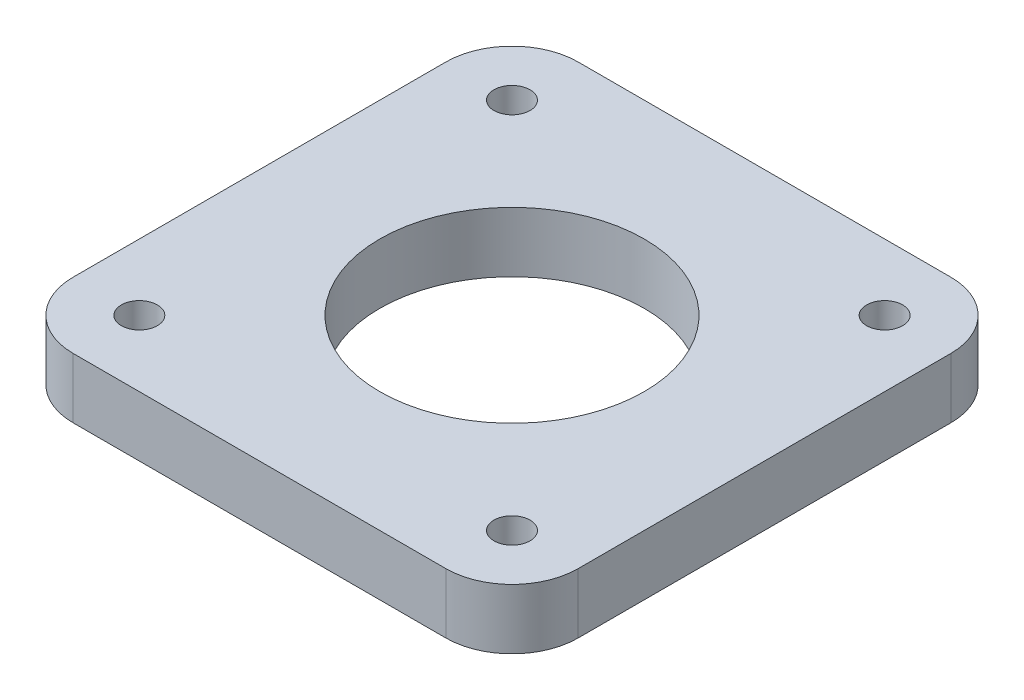
ISO-10303-21;
HEADER;
FILE_DESCRIPTION(('STEP AP214'),'2;1');
FILE_NAME('part.step','',(''),(''),'','','');
FILE_SCHEMA(('AUTOMOTIVE_DESIGN { 1 0 10303 214 1 1 1 1 }'));
ENDSEC;
DATA;
#1=APPLICATION_CONTEXT('core data for automotive mechanical design processes');
#2=APPLICATION_PROTOCOL_DEFINITION('international standard','automotive_design',2000,#1);
#3=PRODUCT_CONTEXT('',#1,'mechanical');
#4=PRODUCT('Part','Part','',(#3));
#5=PRODUCT_RELATED_PRODUCT_CATEGORY('part','',(#4));
#6=PRODUCT_DEFINITION_FORMATION('','',#4);
#7=PRODUCT_DEFINITION_CONTEXT('part definition',#1,'design');
#8=PRODUCT_DEFINITION('design','',#6,#7);
#9=PRODUCT_DEFINITION_SHAPE('','',#8);
#10=(LENGTH_UNIT() NAMED_UNIT(*) SI_UNIT(.MILLI.,.METRE.));
#11=(NAMED_UNIT(*) PLANE_ANGLE_UNIT() SI_UNIT($,.RADIAN.));
#12=(NAMED_UNIT(*) SI_UNIT($,.STERADIAN.) SOLID_ANGLE_UNIT());
#13=UNCERTAINTY_MEASURE_WITH_UNIT(LENGTH_MEASURE(1.E-05),#10,'distance_accuracy_value','');
#14=(GEOMETRIC_REPRESENTATION_CONTEXT(3) GLOBAL_UNCERTAINTY_ASSIGNED_CONTEXT((#13)) GLOBAL_UNIT_ASSIGNED_CONTEXT((#10,
#11,#12)) REPRESENTATION_CONTEXT('',''));
#15=CARTESIAN_POINT('',(0.,0.,0.));
#16=DIRECTION('',(0.,0.,1.));
#17=DIRECTION('',(1.,0.,0.));
#18=AXIS2_PLACEMENT_3D('',#15,#16,#17);
#19=CARTESIAN_POINT('',(15.5,5.,-6.95263157894736));
#20=DIRECTION('',(0.,-1.,0.));
#21=DIRECTION('',(0.,0.,-1.));
#22=AXIS2_PLACEMENT_3D('',#19,#20,#21);
#23=PLANE('',#22);
#24=CARTESIAN_POINT('',(-15.5,5.,-6.95263157894737));
#25=DIRECTION('',(0.,1.,0.));
#26=DIRECTION('',(0.,0.,-1.));
#27=AXIS2_PLACEMENT_3D('',#24,#25,#26);
#28=CIRCLE('',#27,1.5);
#29=CARTESIAN_POINT('',(-15.5,5.,-8.45263157894737));
#30=VERTEX_POINT('',#29);
#31=EDGE_CURVE('E194',#30,#30,#28,.T.);
#32=ORIENTED_EDGE('',*,*,#31,.F.);
#33=EDGE_LOOP('',(#32));
#34=FACE_BOUND('',#33,.T.);
#35=CARTESIAN_POINT('',(15.5,5.,-6.95263157894737));
#36=DIRECTION('',(0.,1.,0.));
#37=DIRECTION('',(0.,0.,1.));
#38=AXIS2_PLACEMENT_3D('',#35,#36,#37);
#39=CIRCLE('',#38,1.5);
#40=CARTESIAN_POINT('',(15.5,5.,-5.45263157894737));
#41=VERTEX_POINT('',#40);
#42=EDGE_CURVE('E182',#41,#41,#39,.T.);
#43=ORIENTED_EDGE('',*,*,#42,.F.);
#44=EDGE_LOOP('',(#43));
#45=FACE_BOUND('',#44,.T.);
#46=CARTESIAN_POINT('',(15.5,5.,-6.95263157894736));
#47=DIRECTION('',(0.,1.,0.));
#48=DIRECTION('',(0.,0.,-1.));
#49=AXIS2_PLACEMENT_3D('',#46,#47,#48);
#50=CIRCLE('',#49,5.50000000000002);
#51=CARTESIAN_POINT('',(21.,5.,-6.95263157894737));
#52=VERTEX_POINT('',#51);
#53=CARTESIAN_POINT('',(15.5,5.,-12.4526315789474));
#54=VERTEX_POINT('',#53);
#55=EDGE_CURVE('E145',#52,#54,#50,.T.);
#56=ORIENTED_EDGE('',*,*,#55,.T.);
#57=DIRECTION('',(-1.,0.,0.));
#58=VECTOR('',#57,1.);
#59=CARTESIAN_POINT('',(-15.5,5.,-12.4526315789474));
#60=LINE('',#59,#58);
#61=CARTESIAN_POINT('',(-15.5,5.,-12.4526315789474));
#62=VERTEX_POINT('',#61);
#63=EDGE_CURVE('E93',#54,#62,#60,.T.);
#64=ORIENTED_EDGE('',*,*,#63,.T.);
#65=CARTESIAN_POINT('',(-15.5,5.,-6.95263157894734));
#66=DIRECTION('',(0.,1.,0.));
#67=DIRECTION('',(0.,0.,1.));
#68=AXIS2_PLACEMENT_3D('',#65,#66,#67);
#69=CIRCLE('',#68,5.50000000000003);
#70=CARTESIAN_POINT('',(-21.,5.,-6.95263157894737));
#71=VERTEX_POINT('',#70);
#72=EDGE_CURVE('E160',#62,#71,#69,.T.);
#73=ORIENTED_EDGE('',*,*,#72,.T.);
#74=DIRECTION('',(0.,0.,1.));
#75=VECTOR('',#74,1.);
#76=CARTESIAN_POINT('',(-21.,5.,-6.95263157894737));
#77=LINE('',#76,#75);
#78=CARTESIAN_POINT('',(-21.,5.,24.0473684210526));
#79=VERTEX_POINT('',#78);
#80=EDGE_CURVE('E173',#71,#79,#77,.T.);
#81=ORIENTED_EDGE('',*,*,#80,.T.);
#82=CARTESIAN_POINT('',(-15.5,5.,24.0473684210526));
#83=DIRECTION('',(0.,1.,0.));
#84=DIRECTION('',(0.,0.,1.));
#85=AXIS2_PLACEMENT_3D('',#82,#83,#84);
#86=CIRCLE('',#85,5.50000000000002);
#87=CARTESIAN_POINT('',(-15.5,5.,29.5473684210526));
#88=VERTEX_POINT('',#87);
#89=EDGE_CURVE('E112',#79,#88,#86,.T.);
#90=ORIENTED_EDGE('',*,*,#89,.T.);
#91=DIRECTION('',(1.,0.,0.));
#92=VECTOR('',#91,1.);
#93=CARTESIAN_POINT('',(-15.5,5.,29.5473684210526));
#94=LINE('',#93,#92);
#95=CARTESIAN_POINT('',(15.5,5.,29.5473684210526));
#96=VERTEX_POINT('',#95);
#97=EDGE_CURVE('E106',#88,#96,#94,.T.);
#98=ORIENTED_EDGE('',*,*,#97,.T.);
#99=CARTESIAN_POINT('',(15.5,5.,24.0473684210526));
#100=DIRECTION('',(0.,1.,0.));
#101=DIRECTION('',(0.,0.,-1.));
#102=AXIS2_PLACEMENT_3D('',#99,#100,#101);
#103=CIRCLE('',#102,5.50000000000002);
#104=CARTESIAN_POINT('',(21.,5.,24.0473684210526));
#105=VERTEX_POINT('',#104);
#106=EDGE_CURVE('E110',#96,#105,#103,.T.);
#107=ORIENTED_EDGE('',*,*,#106,.T.);
#108=DIRECTION('',(0.,0.,-1.));
#109=VECTOR('',#108,1.);
#110=CARTESIAN_POINT('',(21.,5.,-6.95263157894737));
#111=LINE('',#110,#109);
#112=EDGE_CURVE('E50',#105,#52,#111,.T.);
#113=ORIENTED_EDGE('',*,*,#112,.T.);
#114=EDGE_LOOP('',(#56,#64,#73,#81,#90,#98,#107,#113));
#115=FACE_BOUND('',#114,.T.);
#116=CARTESIAN_POINT('',(0.,5.,8.54736842105263));
#117=DIRECTION('',(0.,1.,0.));
#118=DIRECTION('',(0.,0.,1.));
#119=AXIS2_PLACEMENT_3D('',#116,#117,#118);
#120=CIRCLE('',#119,11.);
#121=CARTESIAN_POINT('',(0.,5.,19.5473684210526));
#122=VERTEX_POINT('',#121);
#123=EDGE_CURVE('E134',#122,#122,#120,.T.);
#124=ORIENTED_EDGE('',*,*,#123,.F.);
#125=EDGE_LOOP('',(#124));
#126=FACE_BOUND('',#125,.T.);
#127=CARTESIAN_POINT('',(15.5,5.,24.0473684210526));
#128=DIRECTION('',(0.,1.,0.));
#129=DIRECTION('',(0.,0.,-1.));
#130=AXIS2_PLACEMENT_3D('',#127,#128,#129);
#131=CIRCLE('',#130,1.5);
#132=CARTESIAN_POINT('',(15.5,5.,22.5473684210526));
#133=VERTEX_POINT('',#132);
#134=EDGE_CURVE('E188',#133,#133,#131,.T.);
#135=ORIENTED_EDGE('',*,*,#134,.F.);
#136=EDGE_LOOP('',(#135));
#137=FACE_BOUND('',#136,.T.);
#138=CARTESIAN_POINT('',(-15.5,5.,24.0473684210526));
#139=DIRECTION('',(0.,1.,0.));
#140=DIRECTION('',(0.,0.,1.));
#141=AXIS2_PLACEMENT_3D('',#138,#139,#140);
#142=CIRCLE('',#141,1.5);
#143=CARTESIAN_POINT('',(-15.5,5.,25.5473684210526));
#144=VERTEX_POINT('',#143);
#145=EDGE_CURVE('E200',#144,#144,#142,.T.);
#146=ORIENTED_EDGE('',*,*,#145,.F.);
#147=EDGE_LOOP('',(#146));
#148=FACE_BOUND('',#147,.T.);
#149=ADVANCED_FACE('F33',(#34,#45,#115,#126,#137,#148),#23,.F.);
#150=CARTESIAN_POINT('',(15.5,0.,-6.95263157894736));
#151=DIRECTION('',(0.,-1.,0.));
#152=DIRECTION('',(0.,0.,-1.));
#153=AXIS2_PLACEMENT_3D('',#150,#151,#152);
#154=PLANE('',#153);
#155=CARTESIAN_POINT('',(-15.5,0.,-6.95263157894737));
#156=DIRECTION('',(0.,1.,0.));
#157=DIRECTION('',(0.,0.,-1.));
#158=AXIS2_PLACEMENT_3D('',#155,#156,#157);
#159=CIRCLE('',#158,1.5);
#160=CARTESIAN_POINT('',(-15.5,0.,-8.45263157894737));
#161=VERTEX_POINT('',#160);
#162=EDGE_CURVE('E197',#161,#161,#159,.T.);
#163=ORIENTED_EDGE('',*,*,#162,.T.);
#164=EDGE_LOOP('',(#163));
#165=FACE_BOUND('',#164,.T.);
#166=CARTESIAN_POINT('',(15.5,0.,-6.95263157894737));
#167=DIRECTION('',(0.,1.,0.));
#168=DIRECTION('',(0.,0.,1.));
#169=AXIS2_PLACEMENT_3D('',#166,#167,#168);
#170=CIRCLE('',#169,1.5);
#171=CARTESIAN_POINT('',(15.5,0.,-5.45263157894737));
#172=VERTEX_POINT('',#171);
#173=EDGE_CURVE('E185',#172,#172,#170,.T.);
#174=ORIENTED_EDGE('',*,*,#173,.T.);
#175=EDGE_LOOP('',(#174));
#176=FACE_BOUND('',#175,.T.);
#177=CARTESIAN_POINT('',(15.5,0.,-6.95263157894736));
#178=DIRECTION('',(0.,1.,0.));
#179=DIRECTION('',(0.,0.,-1.));
#180=AXIS2_PLACEMENT_3D('',#177,#178,#179);
#181=CIRCLE('',#180,5.50000000000002);
#182=CARTESIAN_POINT('',(21.,0.,-6.95263157894737));
#183=VERTEX_POINT('',#182);
#184=CARTESIAN_POINT('',(15.5,0.,-12.4526315789474));
#185=VERTEX_POINT('',#184);
#186=EDGE_CURVE('E130',#183,#185,#181,.T.);
#187=ORIENTED_EDGE('',*,*,#186,.F.);
#188=DIRECTION('',(0.,0.,-1.));
#189=VECTOR('',#188,1.);
#190=CARTESIAN_POINT('',(21.,0.,-6.95263157894737));
#191=LINE('',#190,#189);
#192=CARTESIAN_POINT('',(21.,0.,24.0473684210526));
#193=VERTEX_POINT('',#192);
#194=EDGE_CURVE('E85',#193,#183,#191,.T.);
#195=ORIENTED_EDGE('',*,*,#194,.F.);
#196=CARTESIAN_POINT('',(15.5,0.,24.0473684210526));
#197=DIRECTION('',(0.,1.,0.));
#198=DIRECTION('',(0.,0.,-1.));
#199=AXIS2_PLACEMENT_3D('',#196,#197,#198);
#200=CIRCLE('',#199,5.50000000000002);
#201=CARTESIAN_POINT('',(15.5,0.,29.5473684210526));
#202=VERTEX_POINT('',#201);
#203=EDGE_CURVE('E79',#202,#193,#200,.T.);
#204=ORIENTED_EDGE('',*,*,#203,.F.);
#205=DIRECTION('',(1.,0.,0.));
#206=VECTOR('',#205,1.);
#207=CARTESIAN_POINT('',(-15.5,0.,29.5473684210526));
#208=LINE('',#207,#206);
#209=CARTESIAN_POINT('',(-15.5,0.,29.5473684210526));
#210=VERTEX_POINT('',#209);
#211=EDGE_CURVE('E120',#210,#202,#208,.T.);
#212=ORIENTED_EDGE('',*,*,#211,.F.);
#213=CARTESIAN_POINT('',(-15.5,0.,24.0473684210526));
#214=DIRECTION('',(0.,1.,0.));
#215=DIRECTION('',(0.,0.,1.));
#216=AXIS2_PLACEMENT_3D('',#213,#214,#215);
#217=CIRCLE('',#216,5.50000000000002);
#218=CARTESIAN_POINT('',(-21.,0.,24.0473684210526));
#219=VERTEX_POINT('',#218);
#220=EDGE_CURVE('E140',#219,#210,#217,.T.);
#221=ORIENTED_EDGE('',*,*,#220,.F.);
#222=DIRECTION('',(0.,0.,1.));
#223=VECTOR('',#222,1.);
#224=CARTESIAN_POINT('',(-21.,0.,-6.95263157894737));
#225=LINE('',#224,#223);
#226=CARTESIAN_POINT('',(-21.,0.,-6.95263157894737));
#227=VERTEX_POINT('',#226);
#228=EDGE_CURVE('E138',#227,#219,#225,.T.);
#229=ORIENTED_EDGE('',*,*,#228,.F.);
#230=CARTESIAN_POINT('',(-15.5,0.,-6.95263157894734));
#231=DIRECTION('',(0.,1.,0.));
#232=DIRECTION('',(0.,0.,1.));
#233=AXIS2_PLACEMENT_3D('',#230,#231,#232);
#234=CIRCLE('',#233,5.50000000000003);
#235=CARTESIAN_POINT('',(-15.5,0.,-12.4526315789474));
#236=VERTEX_POINT('',#235);
#237=EDGE_CURVE('E136',#236,#227,#234,.T.);
#238=ORIENTED_EDGE('',*,*,#237,.F.);
#239=DIRECTION('',(-1.,0.,0.));
#240=VECTOR('',#239,1.);
#241=CARTESIAN_POINT('',(-15.5,0.,-12.4526315789474));
#242=LINE('',#241,#240);
#243=EDGE_CURVE('E133',#185,#236,#242,.T.);
#244=ORIENTED_EDGE('',*,*,#243,.F.);
#245=EDGE_LOOP('',(#187,#195,#204,#212,#221,#229,#238,#244));
#246=FACE_BOUND('',#245,.T.);
#247=CARTESIAN_POINT('',(0.,0.,8.54736842105263));
#248=DIRECTION('',(0.,1.,0.));
#249=DIRECTION('',(0.,0.,1.));
#250=AXIS2_PLACEMENT_3D('',#247,#248,#249);
#251=CIRCLE('',#250,11.);
#252=CARTESIAN_POINT('',(0.,0.,19.5473684210526));
#253=VERTEX_POINT('',#252);
#254=EDGE_CURVE('E179',#253,#253,#251,.T.);
#255=ORIENTED_EDGE('',*,*,#254,.T.);
#256=EDGE_LOOP('',(#255));
#257=FACE_BOUND('',#256,.T.);
#258=CARTESIAN_POINT('',(15.5,0.,24.0473684210526));
#259=DIRECTION('',(0.,1.,0.));
#260=DIRECTION('',(0.,0.,-1.));
#261=AXIS2_PLACEMENT_3D('',#258,#259,#260);
#262=CIRCLE('',#261,1.5);
#263=CARTESIAN_POINT('',(15.5,0.,22.5473684210526));
#264=VERTEX_POINT('',#263);
#265=EDGE_CURVE('E191',#264,#264,#262,.T.);
#266=ORIENTED_EDGE('',*,*,#265,.T.);
#267=EDGE_LOOP('',(#266));
#268=FACE_BOUND('',#267,.T.);
#269=CARTESIAN_POINT('',(-15.5,0.,24.0473684210526));
#270=DIRECTION('',(0.,1.,0.));
#271=DIRECTION('',(0.,0.,1.));
#272=AXIS2_PLACEMENT_3D('',#269,#270,#271);
#273=CIRCLE('',#272,1.5);
#274=CARTESIAN_POINT('',(-15.5,0.,25.5473684210526));
#275=VERTEX_POINT('',#274);
#276=EDGE_CURVE('E203',#275,#275,#273,.T.);
#277=ORIENTED_EDGE('',*,*,#276,.T.);
#278=EDGE_LOOP('',(#277));
#279=FACE_BOUND('',#278,.T.);
#280=ADVANCED_FACE('F164',(#165,#176,#246,#257,#268,#279),#154,.T.);
#281=CARTESIAN_POINT('',(15.5,5.,-6.95263157894736));
#282=DIRECTION('',(0.,-1.,0.));
#283=DIRECTION('',(0.,0.,-1.));
#284=AXIS2_PLACEMENT_3D('',#281,#282,#283);
#285=CYLINDRICAL_SURFACE('',#284,5.50000000000002);
#286=ORIENTED_EDGE('',*,*,#186,.T.);
#287=DIRECTION('',(0.,-1.,0.));
#288=VECTOR('',#287,1.);
#289=CARTESIAN_POINT('',(15.5,5.,-12.4526315789474));
#290=LINE('',#289,#288);
#291=EDGE_CURVE('E11',#54,#185,#290,.T.);
#292=ORIENTED_EDGE('',*,*,#291,.F.);
#293=ORIENTED_EDGE('',*,*,#55,.F.);
#294=DIRECTION('',(0.,-1.,0.));
#295=VECTOR('',#294,1.);
#296=CARTESIAN_POINT('',(21.,5.,-6.95263157894737));
#297=LINE('',#296,#295);
#298=EDGE_CURVE('E126',#52,#183,#297,.T.);
#299=ORIENTED_EDGE('',*,*,#298,.T.);
#300=EDGE_LOOP('',(#286,#292,#293,#299));
#301=FACE_BOUND('',#300,.T.);
#302=ADVANCED_FACE('F35',(#301),#285,.T.);
#303=CARTESIAN_POINT('',(-15.5,5.,-12.4526315789474));
#304=DIRECTION('',(0.,0.,1.));
#305=DIRECTION('',(1.,0.,0.));
#306=AXIS2_PLACEMENT_3D('',#303,#304,#305);
#307=PLANE('',#306);
#308=ORIENTED_EDGE('',*,*,#243,.T.);
#309=DIRECTION('',(0.,-1.,0.));
#310=VECTOR('',#309,1.);
#311=CARTESIAN_POINT('',(-15.5,5.,-12.4526315789474));
#312=LINE('',#311,#310);
#313=EDGE_CURVE('E42',#62,#236,#312,.T.);
#314=ORIENTED_EDGE('',*,*,#313,.F.);
#315=ORIENTED_EDGE('',*,*,#63,.F.);
#316=ORIENTED_EDGE('',*,*,#291,.T.);
#317=EDGE_LOOP('',(#308,#314,#315,#316));
#318=FACE_BOUND('',#317,.T.);
#319=ADVANCED_FACE('F238',(#318),#307,.F.);
#320=CARTESIAN_POINT('',(-15.5,5.,-6.95263157894734));
#321=DIRECTION('',(0.,-1.,0.));
#322=DIRECTION('',(0.,0.,-1.));
#323=AXIS2_PLACEMENT_3D('',#320,#321,#322);
#324=CYLINDRICAL_SURFACE('',#323,5.50000000000003);
#325=ORIENTED_EDGE('',*,*,#237,.T.);
#326=DIRECTION('',(0.,-1.,0.));
#327=VECTOR('',#326,1.);
#328=CARTESIAN_POINT('',(-21.,5.,-6.95263157894737));
#329=LINE('',#328,#327);
#330=EDGE_CURVE('E152',#71,#227,#329,.T.);
#331=ORIENTED_EDGE('',*,*,#330,.F.);
#332=ORIENTED_EDGE('',*,*,#72,.F.);
#333=ORIENTED_EDGE('',*,*,#313,.T.);
#334=EDGE_LOOP('',(#325,#331,#332,#333));
#335=FACE_BOUND('',#334,.T.);
#336=ADVANCED_FACE('F158',(#335),#324,.T.);
#337=CARTESIAN_POINT('',(-21.,5.,-6.95263157894737));
#338=DIRECTION('',(1.,0.,0.));
#339=DIRECTION('',(0.,0.,-1.));
#340=AXIS2_PLACEMENT_3D('',#337,#338,#339);
#341=PLANE('',#340);
#342=ORIENTED_EDGE('',*,*,#228,.T.);
#343=DIRECTION('',(0.,-1.,0.));
#344=VECTOR('',#343,1.);
#345=CARTESIAN_POINT('',(-21.,5.,24.0473684210526));
#346=LINE('',#345,#344);
#347=EDGE_CURVE('E149',#79,#219,#346,.T.);
#348=ORIENTED_EDGE('',*,*,#347,.F.);
#349=ORIENTED_EDGE('',*,*,#80,.F.);
#350=ORIENTED_EDGE('',*,*,#330,.T.);
#351=EDGE_LOOP('',(#342,#348,#349,#350));
#352=FACE_BOUND('',#351,.T.);
#353=ADVANCED_FACE('F169',(#352),#341,.F.);
#354=CARTESIAN_POINT('',(-15.5,5.,24.0473684210526));
#355=DIRECTION('',(0.,-1.,0.));
#356=DIRECTION('',(0.,0.,-1.));
#357=AXIS2_PLACEMENT_3D('',#354,#355,#356);
#358=CYLINDRICAL_SURFACE('',#357,5.50000000000002);
#359=ORIENTED_EDGE('',*,*,#220,.T.);
#360=DIRECTION('',(0.,-1.,0.));
#361=VECTOR('',#360,1.);
#362=CARTESIAN_POINT('',(-15.5,5.,29.5473684210526));
#363=LINE('',#362,#361);
#364=EDGE_CURVE('E121',#88,#210,#363,.T.);
#365=ORIENTED_EDGE('',*,*,#364,.F.);
#366=ORIENTED_EDGE('',*,*,#89,.F.);
#367=ORIENTED_EDGE('',*,*,#347,.T.);
#368=EDGE_LOOP('',(#359,#365,#366,#367));
#369=FACE_BOUND('',#368,.T.);
#370=ADVANCED_FACE('F172',(#369),#358,.T.);
#371=CARTESIAN_POINT('',(-15.5,5.,29.5473684210526));
#372=DIRECTION('',(0.,0.,-1.));
#373=DIRECTION('',(-1.,0.,0.));
#374=AXIS2_PLACEMENT_3D('',#371,#372,#373);
#375=PLANE('',#374);
#376=ORIENTED_EDGE('',*,*,#211,.T.);
#377=DIRECTION('',(0.,-1.,0.));
#378=VECTOR('',#377,1.);
#379=CARTESIAN_POINT('',(15.5,5.,29.5473684210526));
#380=LINE('',#379,#378);
#381=EDGE_CURVE('E117',#96,#202,#380,.T.);
#382=ORIENTED_EDGE('',*,*,#381,.F.);
#383=ORIENTED_EDGE('',*,*,#97,.F.);
#384=ORIENTED_EDGE('',*,*,#364,.T.);
#385=EDGE_LOOP('',(#376,#382,#383,#384));
#386=FACE_BOUND('',#385,.T.);
#387=ADVANCED_FACE('F118',(#386),#375,.F.);
#388=CARTESIAN_POINT('',(15.5,5.,24.0473684210526));
#389=DIRECTION('',(0.,-1.,0.));
#390=DIRECTION('',(0.,0.,-1.));
#391=AXIS2_PLACEMENT_3D('',#388,#389,#390);
#392=CYLINDRICAL_SURFACE('',#391,5.50000000000002);
#393=ORIENTED_EDGE('',*,*,#203,.T.);
#394=DIRECTION('',(0.,-1.,0.));
#395=VECTOR('',#394,1.);
#396=CARTESIAN_POINT('',(21.,5.,24.0473684210526));
#397=LINE('',#396,#395);
#398=EDGE_CURVE('E122',#105,#193,#397,.T.);
#399=ORIENTED_EDGE('',*,*,#398,.F.);
#400=ORIENTED_EDGE('',*,*,#106,.F.);
#401=ORIENTED_EDGE('',*,*,#381,.T.);
#402=EDGE_LOOP('',(#393,#399,#400,#401));
#403=FACE_BOUND('',#402,.T.);
#404=ADVANCED_FACE('F124',(#403),#392,.T.);
#405=CARTESIAN_POINT('',(21.,5.,-6.95263157894737));
#406=DIRECTION('',(-1.,0.,0.));
#407=DIRECTION('',(0.,0.,1.));
#408=AXIS2_PLACEMENT_3D('',#405,#406,#407);
#409=PLANE('',#408);
#410=ORIENTED_EDGE('',*,*,#194,.T.);
#411=ORIENTED_EDGE('',*,*,#298,.F.);
#412=ORIENTED_EDGE('',*,*,#112,.F.);
#413=ORIENTED_EDGE('',*,*,#398,.T.);
#414=EDGE_LOOP('',(#410,#411,#412,#413));
#415=FACE_BOUND('',#414,.T.);
#416=ADVANCED_FACE('F226',(#415),#409,.F.);
#417=CARTESIAN_POINT('',(0.,5.,8.54736842105263));
#418=DIRECTION('',(0.,-1.,0.));
#419=DIRECTION('',(0.,0.,-1.));
#420=AXIS2_PLACEMENT_3D('',#417,#418,#419);
#421=CYLINDRICAL_SURFACE('',#420,11.);
#422=ORIENTED_EDGE('',*,*,#123,.T.);
#423=EDGE_LOOP('',(#422));
#424=FACE_BOUND('',#423,.T.);
#425=ORIENTED_EDGE('',*,*,#254,.F.);
#426=EDGE_LOOP('',(#425));
#427=FACE_BOUND('',#426,.T.);
#428=ADVANCED_FACE('F223',(#424,#427),#421,.F.);
#429=CARTESIAN_POINT('',(15.5,5.,-6.95263157894737));
#430=DIRECTION('',(0.,-1.,0.));
#431=DIRECTION('',(0.,0.,-1.));
#432=AXIS2_PLACEMENT_3D('',#429,#430,#431);
#433=CYLINDRICAL_SURFACE('',#432,1.5);
#434=ORIENTED_EDGE('',*,*,#42,.T.);
#435=EDGE_LOOP('',(#434));
#436=FACE_BOUND('',#435,.T.);
#437=ORIENTED_EDGE('',*,*,#173,.F.);
#438=EDGE_LOOP('',(#437));
#439=FACE_BOUND('',#438,.T.);
#440=ADVANCED_FACE('F302',(#436,#439),#433,.F.);
#441=CARTESIAN_POINT('',(15.5,5.,24.0473684210526));
#442=DIRECTION('',(0.,-1.,0.));
#443=DIRECTION('',(0.,0.,-1.));
#444=AXIS2_PLACEMENT_3D('',#441,#442,#443);
#445=CYLINDRICAL_SURFACE('',#444,1.5);
#446=ORIENTED_EDGE('',*,*,#134,.T.);
#447=EDGE_LOOP('',(#446));
#448=FACE_BOUND('',#447,.T.);
#449=ORIENTED_EDGE('',*,*,#265,.F.);
#450=EDGE_LOOP('',(#449));
#451=FACE_BOUND('',#450,.T.);
#452=ADVANCED_FACE('F310',(#448,#451),#445,.F.);
#453=CARTESIAN_POINT('',(-15.5,5.,-6.95263157894737));
#454=DIRECTION('',(0.,-1.,0.));
#455=DIRECTION('',(0.,0.,-1.));
#456=AXIS2_PLACEMENT_3D('',#453,#454,#455);
#457=CYLINDRICAL_SURFACE('',#456,1.5);
#458=ORIENTED_EDGE('',*,*,#31,.T.);
#459=EDGE_LOOP('',(#458));
#460=FACE_BOUND('',#459,.T.);
#461=ORIENTED_EDGE('',*,*,#162,.F.);
#462=EDGE_LOOP('',(#461));
#463=FACE_BOUND('',#462,.T.);
#464=ADVANCED_FACE('F318',(#460,#463),#457,.F.);
#465=CARTESIAN_POINT('',(-15.5,5.,24.0473684210526));
#466=DIRECTION('',(0.,-1.,0.));
#467=DIRECTION('',(0.,0.,-1.));
#468=AXIS2_PLACEMENT_3D('',#465,#466,#467);
#469=CYLINDRICAL_SURFACE('',#468,1.5);
#470=ORIENTED_EDGE('',*,*,#145,.T.);
#471=EDGE_LOOP('',(#470));
#472=FACE_BOUND('',#471,.T.);
#473=ORIENTED_EDGE('',*,*,#276,.F.);
#474=EDGE_LOOP('',(#473));
#475=FACE_BOUND('',#474,.T.);
#476=ADVANCED_FACE('F209',(#472,#475),#469,.F.);
#477=CLOSED_SHELL('',(#149,#280,#302,#319,#336,#353,#370,#387,#404,#416,#428,#440,#452,#464,#476));
#478=MANIFOLD_SOLID_BREP('B2',#477);
#479=ADVANCED_BREP_SHAPE_REPRESENTATION('',(#18,#478),#14);
#480=SHAPE_DEFINITION_REPRESENTATION(#9,#479);
ENDSEC;
END-ISO-10303-21;
